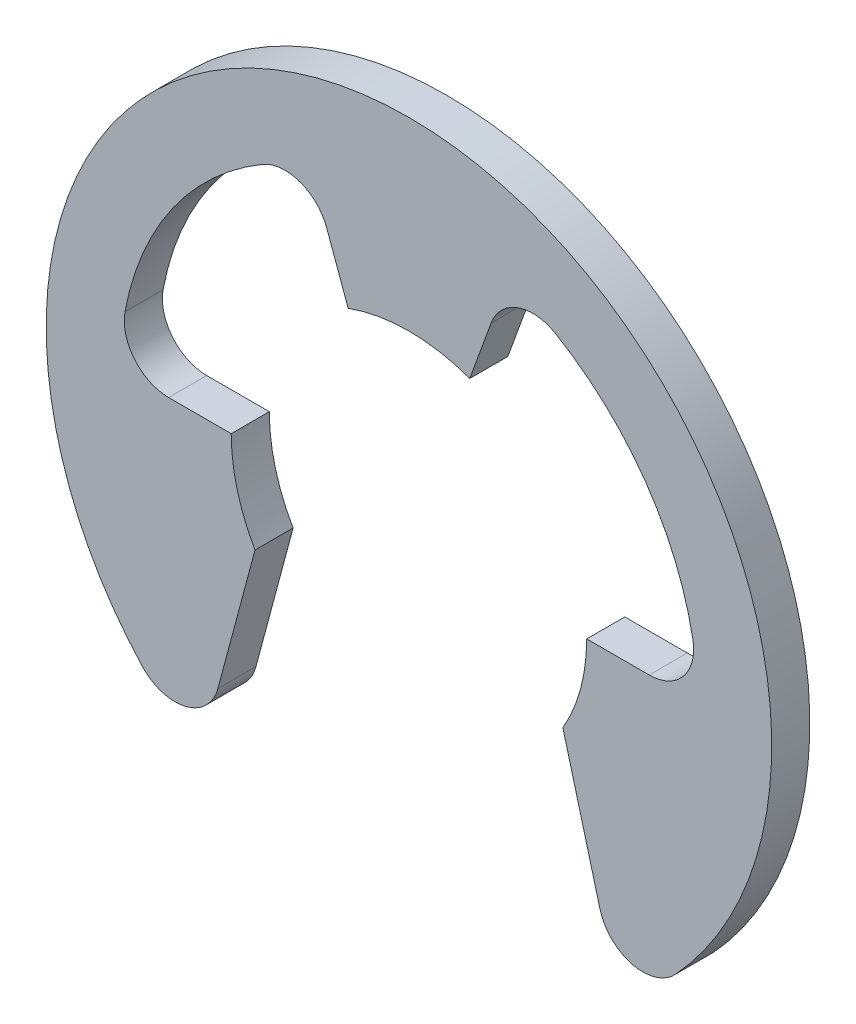
ISO-10303-21;
HEADER;
FILE_DESCRIPTION(('STEP AP214'),'2;1');
FILE_NAME('part.step','',(''),(''),'','','');
FILE_SCHEMA(('AUTOMOTIVE_DESIGN { 1 0 10303 214 1 1 1 1 }'));
ENDSEC;
DATA;
#1=APPLICATION_CONTEXT('core data for automotive mechanical design processes');
#2=APPLICATION_PROTOCOL_DEFINITION('international standard','automotive_design',2000,#1);
#3=PRODUCT_CONTEXT('',#1,'mechanical');
#4=PRODUCT('Part','Part','',(#3));
#5=PRODUCT_RELATED_PRODUCT_CATEGORY('part','',(#4));
#6=PRODUCT_DEFINITION_FORMATION('','',#4);
#7=PRODUCT_DEFINITION_CONTEXT('part definition',#1,'design');
#8=PRODUCT_DEFINITION('design','',#6,#7);
#9=PRODUCT_DEFINITION_SHAPE('','',#8);
#10=(LENGTH_UNIT() NAMED_UNIT(*) SI_UNIT(.MILLI.,.METRE.));
#11=(NAMED_UNIT(*) PLANE_ANGLE_UNIT() SI_UNIT($,.RADIAN.));
#12=(NAMED_UNIT(*) SI_UNIT($,.STERADIAN.) SOLID_ANGLE_UNIT());
#13=UNCERTAINTY_MEASURE_WITH_UNIT(LENGTH_MEASURE(1.E-05),#10,'distance_accuracy_value','');
#14=(GEOMETRIC_REPRESENTATION_CONTEXT(3) GLOBAL_UNCERTAINTY_ASSIGNED_CONTEXT((#13)) GLOBAL_UNIT_ASSIGNED_CONTEXT((#10,
#11,#12)) REPRESENTATION_CONTEXT('',''));
#15=CARTESIAN_POINT('',(0.,0.,0.));
#16=DIRECTION('',(0.,0.,1.));
#17=DIRECTION('',(1.,0.,0.));
#18=AXIS2_PLACEMENT_3D('',#15,#16,#17);
#19=CARTESIAN_POINT('',(0.,0.,-1.0668));
#20=DIRECTION('',(0.,0.,1.));
#21=DIRECTION('',(1.,0.,0.));
#22=AXIS2_PLACEMENT_3D('',#19,#20,#21);
#23=CYLINDRICAL_SURFACE('',#22,4.9784);
#24=CARTESIAN_POINT('',(0.,0.,0.));
#25=DIRECTION('',(0.,0.,-1.));
#26=DIRECTION('',(1.,0.,0.));
#27=AXIS2_PLACEMENT_3D('',#24,#25,#26);
#28=CIRCLE('',#27,4.9784);
#29=CARTESIAN_POINT('',(4.9784,0.,0.));
#30=VERTEX_POINT('',#29);
#31=CARTESIAN_POINT('',(4.31142087020045,-2.4892,0.));
#32=VERTEX_POINT('',#31);
#33=EDGE_CURVE('E191',#30,#32,#28,.T.);
#34=ORIENTED_EDGE('',*,*,#33,.F.);
#35=DIRECTION('',(0.,0.,1.));
#36=VECTOR('',#35,1.);
#37=CARTESIAN_POINT('',(4.9784,0.,-1.0668));
#38=LINE('',#37,#36);
#39=CARTESIAN_POINT('',(4.9784,0.,-1.0668));
#40=VERTEX_POINT('',#39);
#41=EDGE_CURVE('E11',#40,#30,#38,.T.);
#42=ORIENTED_EDGE('',*,*,#41,.F.);
#43=CARTESIAN_POINT('',(0.,0.,-1.0668));
#44=DIRECTION('',(0.,0.,-1.));
#45=DIRECTION('',(1.,0.,0.));
#46=AXIS2_PLACEMENT_3D('',#43,#44,#45);
#47=CIRCLE('',#46,4.9784);
#48=CARTESIAN_POINT('',(4.31142087020045,-2.4892,-1.0668));
#49=VERTEX_POINT('',#48);
#50=EDGE_CURVE('E243',#40,#49,#47,.T.);
#51=ORIENTED_EDGE('',*,*,#50,.T.);
#52=DIRECTION('',(0.,0.,1.));
#53=VECTOR('',#52,1.);
#54=CARTESIAN_POINT('',(4.31142087020045,-2.4892,-1.0668));
#55=LINE('',#54,#53);
#56=EDGE_CURVE('E37',#49,#32,#55,.T.);
#57=ORIENTED_EDGE('',*,*,#56,.T.);
#58=EDGE_LOOP('',(#34,#42,#51,#57));
#59=FACE_BOUND('',#58,.T.);
#60=ADVANCED_FACE('F34',(#59),#23,.F.);
#61=CARTESIAN_POINT('',(4.9784,0.,-1.0668));
#62=DIRECTION('',(0.,1.,0.));
#63=DIRECTION('',(-1.,0.,0.));
#64=AXIS2_PLACEMENT_3D('',#61,#62,#63);
#65=PLANE('',#64);
#66=DIRECTION('',(-1.,0.,0.));
#67=VECTOR('',#66,1.);
#68=CARTESIAN_POINT('',(4.9784,0.,0.));
#69=LINE('',#68,#67);
#70=CARTESIAN_POINT('',(6.7298416603305,0.,0.));
#71=VERTEX_POINT('',#70);
#72=EDGE_CURVE('E241',#71,#30,#69,.T.);
#73=ORIENTED_EDGE('',*,*,#72,.F.);
#74=DIRECTION('',(0.,0.,1.));
#75=VECTOR('',#74,1.);
#76=CARTESIAN_POINT('',(6.7298416603305,0.,-1.0668));
#77=LINE('',#76,#75);
#78=CARTESIAN_POINT('',(6.7298416603305,0.,-1.0668));
#79=VERTEX_POINT('',#78);
#80=EDGE_CURVE('E43',#79,#71,#77,.T.);
#81=ORIENTED_EDGE('',*,*,#80,.F.);
#82=DIRECTION('',(-1.,0.,0.));
#83=VECTOR('',#82,1.);
#84=CARTESIAN_POINT('',(4.9784,0.,-1.0668));
#85=LINE('',#84,#83);
#86=EDGE_CURVE('E181',#79,#40,#85,.T.);
#87=ORIENTED_EDGE('',*,*,#86,.T.);
#88=ORIENTED_EDGE('',*,*,#41,.T.);
#89=EDGE_LOOP('',(#73,#81,#87,#88));
#90=FACE_BOUND('',#89,.T.);
#91=ADVANCED_FACE('F275',(#90),#65,.T.);
#92=CARTESIAN_POINT('',(6.7298416603305,1.243584,-1.0668));
#93=DIRECTION('',(0.,0.,1.));
#94=DIRECTION('',(1.,0.,0.));
#95=AXIS2_PLACEMENT_3D('',#92,#93,#94);
#96=CYLINDRICAL_SURFACE('',#95,1.243584);
#97=CARTESIAN_POINT('',(6.7298416603305,1.243584,0.));
#98=DIRECTION('',(0.,0.,-1.));
#99=DIRECTION('',(1.,0.,0.));
#100=AXIS2_PLACEMENT_3D('',#97,#98,#99);
#101=CIRCLE('',#100,1.243584);
#102=CARTESIAN_POINT('',(7.95272262711264,1.46955591448931,0.));
#103=VERTEX_POINT('',#102);
#104=EDGE_CURVE('E168',#103,#71,#101,.T.);
#105=ORIENTED_EDGE('',*,*,#104,.F.);
#106=DIRECTION('',(0.,0.,1.));
#107=VECTOR('',#106,1.);
#108=CARTESIAN_POINT('',(7.95272262711264,1.46955591448931,-1.0668));
#109=LINE('',#108,#107);
#110=CARTESIAN_POINT('',(7.95272262711264,1.46955591448931,-1.0668));
#111=VERTEX_POINT('',#110);
#112=EDGE_CURVE('E163',#111,#103,#109,.T.);
#113=ORIENTED_EDGE('',*,*,#112,.F.);
#114=CARTESIAN_POINT('',(6.7298416603305,1.243584,-1.0668));
#115=DIRECTION('',(0.,0.,-1.));
#116=DIRECTION('',(1.,0.,0.));
#117=AXIS2_PLACEMENT_3D('',#114,#115,#116);
#118=CIRCLE('',#117,1.243584);
#119=EDGE_CURVE('E166',#111,#79,#118,.T.);
#120=ORIENTED_EDGE('',*,*,#119,.T.);
#121=ORIENTED_EDGE('',*,*,#80,.T.);
#122=EDGE_LOOP('',(#105,#113,#120,#121));
#123=FACE_BOUND('',#122,.T.);
#124=ADVANCED_FACE('F165',(#123),#96,.F.);
#125=CARTESIAN_POINT('',(0.,0.,-1.0668));
#126=DIRECTION('',(0.,0.,1.));
#127=DIRECTION('',(1.,0.,0.));
#128=AXIS2_PLACEMENT_3D('',#125,#126,#127);
#129=CYLINDRICAL_SURFACE('',#128,8.08736);
#130=CARTESIAN_POINT('',(0.,0.,0.));
#131=DIRECTION('',(0.,0.,-1.));
#132=DIRECTION('',(1.,0.,0.));
#133=AXIS2_PLACEMENT_3D('',#130,#131,#132);
#134=CIRCLE('',#133,8.08736);
#135=CARTESIAN_POINT('',(4.10092218143226,6.97049704335615,0.));
#136=VERTEX_POINT('',#135);
#137=EDGE_CURVE('E238',#136,#103,#134,.T.);
#138=ORIENTED_EDGE('',*,*,#137,.F.);
#139=DIRECTION('',(0.,0.,1.));
#140=VECTOR('',#139,1.);
#141=CARTESIAN_POINT('',(4.10092218143226,6.97049704335615,-1.0668));
#142=LINE('',#141,#140);
#143=CARTESIAN_POINT('',(4.10092218143226,6.97049704335615,-1.0668));
#144=VERTEX_POINT('',#143);
#145=EDGE_CURVE('E173',#144,#136,#142,.T.);
#146=ORIENTED_EDGE('',*,*,#145,.F.);
#147=CARTESIAN_POINT('',(0.,0.,-1.0668));
#148=DIRECTION('',(0.,0.,-1.));
#149=DIRECTION('',(1.,0.,0.));
#150=AXIS2_PLACEMENT_3D('',#147,#148,#149);
#151=CIRCLE('',#150,8.08736);
#152=EDGE_CURVE('E179',#144,#111,#151,.T.);
#153=ORIENTED_EDGE('',*,*,#152,.T.);
#154=ORIENTED_EDGE('',*,*,#112,.T.);
#155=EDGE_LOOP('',(#138,#146,#153,#154));
#156=FACE_BOUND('',#155,.T.);
#157=ADVANCED_FACE('F183',(#156),#129,.F.);
#158=CARTESIAN_POINT('',(3.47032811735272,5.89865176935265,-1.0668));
#159=DIRECTION('',(0.,0.,1.));
#160=DIRECTION('',(1.,0.,0.));
#161=AXIS2_PLACEMENT_3D('',#158,#159,#160);
#162=CYLINDRICAL_SURFACE('',#161,1.243584);
#163=CARTESIAN_POINT('',(3.47032811735272,5.89865176935265,0.));
#164=DIRECTION('',(0.,0.,-1.));
#165=DIRECTION('',(-1.,0.,0.));
#166=AXIS2_PLACEMENT_3D('',#163,#164,#165);
#167=CIRCLE('',#166,1.243584);
#168=CARTESIAN_POINT('',(2.3017414092253,6.32398254727016,0.));
#169=VERTEX_POINT('',#168);
#170=EDGE_CURVE('E235',#169,#136,#167,.T.);
#171=ORIENTED_EDGE('',*,*,#170,.F.);
#172=DIRECTION('',(0.,0.,1.));
#173=VECTOR('',#172,1.);
#174=CARTESIAN_POINT('',(2.3017414092253,6.32398254727016,-1.0668));
#175=LINE('',#174,#173);
#176=CARTESIAN_POINT('',(2.3017414092253,6.32398254727016,-1.0668));
#177=VERTEX_POINT('',#176);
#178=EDGE_CURVE('E247',#177,#169,#175,.T.);
#179=ORIENTED_EDGE('',*,*,#178,.F.);
#180=CARTESIAN_POINT('',(3.47032811735272,5.89865176935265,-1.0668));
#181=DIRECTION('',(0.,0.,-1.));
#182=DIRECTION('',(-1.,0.,0.));
#183=AXIS2_PLACEMENT_3D('',#180,#181,#182);
#184=CIRCLE('',#183,1.243584);
#185=EDGE_CURVE('E184',#177,#144,#184,.T.);
#186=ORIENTED_EDGE('',*,*,#185,.T.);
#187=ORIENTED_EDGE('',*,*,#145,.T.);
#188=EDGE_LOOP('',(#171,#179,#186,#187));
#189=FACE_BOUND('',#188,.T.);
#190=ADVANCED_FACE('F288',(#189),#162,.F.);
#191=CARTESIAN_POINT('',(1.70271308153251,4.67816574332056,-1.0668));
#192=DIRECTION('',(0.939692620785908,-0.342020143325669,0.));
#193=DIRECTION('',(0.342020143325669,0.939692620785908,0.));
#194=AXIS2_PLACEMENT_3D('',#191,#192,#193);
#195=PLANE('',#194);
#196=DIRECTION('',(0.342020143325669,0.939692620785908,0.));
#197=VECTOR('',#196,1.);
#198=CARTESIAN_POINT('',(1.70271308153251,4.67816574332056,0.));
#199=LINE('',#198,#197);
#200=CARTESIAN_POINT('',(1.70271308153251,4.67816574332056,0.));
#201=VERTEX_POINT('',#200);
#202=EDGE_CURVE('E232',#201,#169,#199,.T.);
#203=ORIENTED_EDGE('',*,*,#202,.F.);
#204=DIRECTION('',(0.,0.,1.));
#205=VECTOR('',#204,1.);
#206=CARTESIAN_POINT('',(1.70271308153251,4.67816574332056,-1.0668));
#207=LINE('',#206,#205);
#208=CARTESIAN_POINT('',(1.70271308153251,4.67816574332056,-1.0668));
#209=VERTEX_POINT('',#208);
#210=EDGE_CURVE('E249',#209,#201,#207,.T.);
#211=ORIENTED_EDGE('',*,*,#210,.F.);
#212=DIRECTION('',(0.342020143325669,0.939692620785908,0.));
#213=VECTOR('',#212,1.);
#214=CARTESIAN_POINT('',(1.70271308153251,4.67816574332056,-1.0668));
#215=LINE('',#214,#213);
#216=EDGE_CURVE('E186',#209,#177,#215,.T.);
#217=ORIENTED_EDGE('',*,*,#216,.T.);
#218=ORIENTED_EDGE('',*,*,#178,.T.);
#219=EDGE_LOOP('',(#203,#211,#217,#218));
#220=FACE_BOUND('',#219,.T.);
#221=ADVANCED_FACE('F291',(#220),#195,.T.);
#222=CARTESIAN_POINT('',(0.,0.,-1.0668));
#223=DIRECTION('',(0.,0.,1.));
#224=DIRECTION('',(1.,0.,0.));
#225=AXIS2_PLACEMENT_3D('',#222,#223,#224);
#226=CYLINDRICAL_SURFACE('',#225,4.9784);
#227=CARTESIAN_POINT('',(0.,0.,0.));
#228=DIRECTION('',(0.,0.,-1.));
#229=DIRECTION('',(1.,0.,0.));
#230=AXIS2_PLACEMENT_3D('',#227,#228,#229);
#231=CIRCLE('',#230,4.9784);
#232=CARTESIAN_POINT('',(-1.70271308153251,4.67816574332056,0.));
#233=VERTEX_POINT('',#232);
#234=EDGE_CURVE('E229',#233,#201,#231,.T.);
#235=ORIENTED_EDGE('',*,*,#234,.F.);
#236=DIRECTION('',(0.,0.,1.));
#237=VECTOR('',#236,1.);
#238=CARTESIAN_POINT('',(-1.70271308153251,4.67816574332056,-1.0668));
#239=LINE('',#238,#237);
#240=CARTESIAN_POINT('',(-1.70271308153251,4.67816574332056,-1.0668));
#241=VERTEX_POINT('',#240);
#242=EDGE_CURVE('E251',#241,#233,#239,.T.);
#243=ORIENTED_EDGE('',*,*,#242,.F.);
#244=CARTESIAN_POINT('',(0.,0.,-1.0668));
#245=DIRECTION('',(0.,0.,-1.));
#246=DIRECTION('',(1.,0.,0.));
#247=AXIS2_PLACEMENT_3D('',#244,#245,#246);
#248=CIRCLE('',#247,4.9784);
#249=EDGE_CURVE('E507',#241,#209,#248,.T.);
#250=ORIENTED_EDGE('',*,*,#249,.T.);
#251=ORIENTED_EDGE('',*,*,#210,.T.);
#252=EDGE_LOOP('',(#235,#243,#250,#251));
#253=FACE_BOUND('',#252,.T.);
#254=ADVANCED_FACE('F295',(#253),#226,.F.);
#255=CARTESIAN_POINT('',(-1.70271308153252,4.67816574332056,-1.0668));
#256=DIRECTION('',(-0.939692620785908,-0.34202014332567,0.));
#257=DIRECTION('',(0.34202014332567,-0.939692620785908,0.));
#258=AXIS2_PLACEMENT_3D('',#255,#256,#257);
#259=PLANE('',#258);
#260=DIRECTION('',(0.34202014332567,-0.939692620785908,0.));
#261=VECTOR('',#260,1.);
#262=CARTESIAN_POINT('',(-1.70271308153252,4.67816574332056,0.));
#263=LINE('',#262,#261);
#264=CARTESIAN_POINT('',(-2.3017414092253,6.32398254727015,0.));
#265=VERTEX_POINT('',#264);
#266=EDGE_CURVE('E226',#265,#233,#263,.T.);
#267=ORIENTED_EDGE('',*,*,#266,.F.);
#268=DIRECTION('',(0.,0.,1.));
#269=VECTOR('',#268,1.);
#270=CARTESIAN_POINT('',(-2.3017414092253,6.32398254727015,-1.0668));
#271=LINE('',#270,#269);
#272=CARTESIAN_POINT('',(-2.3017414092253,6.32398254727015,-1.0668));
#273=VERTEX_POINT('',#272);
#274=EDGE_CURVE('E253',#273,#265,#271,.T.);
#275=ORIENTED_EDGE('',*,*,#274,.F.);
#276=DIRECTION('',(0.34202014332567,-0.939692620785908,0.));
#277=VECTOR('',#276,1.);
#278=CARTESIAN_POINT('',(-1.70271308153252,4.67816574332056,-1.0668));
#279=LINE('',#278,#277);
#280=EDGE_CURVE('E511',#273,#241,#279,.T.);
#281=ORIENTED_EDGE('',*,*,#280,.T.);
#282=ORIENTED_EDGE('',*,*,#242,.T.);
#283=EDGE_LOOP('',(#267,#275,#281,#282));
#284=FACE_BOUND('',#283,.T.);
#285=ADVANCED_FACE('F299',(#284),#259,.T.);
#286=CARTESIAN_POINT('',(-3.47032811735273,5.89865176935264,-1.0668));
#287=DIRECTION('',(0.,0.,1.));
#288=DIRECTION('',(1.,0.,0.));
#289=AXIS2_PLACEMENT_3D('',#286,#287,#288);
#290=CYLINDRICAL_SURFACE('',#289,1.243584);
#291=CARTESIAN_POINT('',(-3.47032811735273,5.89865176935264,0.));
#292=DIRECTION('',(0.,0.,-1.));
#293=DIRECTION('',(1.,0.,0.));
#294=AXIS2_PLACEMENT_3D('',#291,#292,#293);
#295=CIRCLE('',#294,1.243584);
#296=CARTESIAN_POINT('',(-4.10092218143226,6.97049704335615,0.));
#297=VERTEX_POINT('',#296);
#298=EDGE_CURVE('E223',#297,#265,#295,.T.);
#299=ORIENTED_EDGE('',*,*,#298,.F.);
#300=DIRECTION('',(0.,0.,1.));
#301=VECTOR('',#300,1.);
#302=CARTESIAN_POINT('',(-4.10092218143226,6.97049704335615,-1.0668));
#303=LINE('',#302,#301);
#304=CARTESIAN_POINT('',(-4.10092218143226,6.97049704335615,-1.0668));
#305=VERTEX_POINT('',#304);
#306=EDGE_CURVE('E255',#305,#297,#303,.T.);
#307=ORIENTED_EDGE('',*,*,#306,.F.);
#308=CARTESIAN_POINT('',(-3.47032811735273,5.89865176935264,-1.0668));
#309=DIRECTION('',(0.,0.,-1.));
#310=DIRECTION('',(1.,0.,0.));
#311=AXIS2_PLACEMENT_3D('',#308,#309,#310);
#312=CIRCLE('',#311,1.243584);
#313=EDGE_CURVE('E500',#305,#273,#312,.T.);
#314=ORIENTED_EDGE('',*,*,#313,.T.);
#315=ORIENTED_EDGE('',*,*,#274,.T.);
#316=EDGE_LOOP('',(#299,#307,#314,#315));
#317=FACE_BOUND('',#316,.T.);
#318=ADVANCED_FACE('F303',(#317),#290,.F.);
#319=CARTESIAN_POINT('',(0.,0.,-1.0668));
#320=DIRECTION('',(0.,0.,1.));
#321=DIRECTION('',(1.,0.,0.));
#322=AXIS2_PLACEMENT_3D('',#319,#320,#321);
#323=CYLINDRICAL_SURFACE('',#322,8.08736);
#324=CARTESIAN_POINT('',(0.,0.,0.));
#325=DIRECTION('',(0.,0.,-1.));
#326=DIRECTION('',(1.,0.,0.));
#327=AXIS2_PLACEMENT_3D('',#324,#325,#326);
#328=CIRCLE('',#327,8.08736);
#329=CARTESIAN_POINT('',(-7.95272262711264,1.46955591448931,0.));
#330=VERTEX_POINT('',#329);
#331=EDGE_CURVE('E220',#330,#297,#328,.T.);
#332=ORIENTED_EDGE('',*,*,#331,.F.);
#333=DIRECTION('',(0.,0.,1.));
#334=VECTOR('',#333,1.);
#335=CARTESIAN_POINT('',(-7.95272262711264,1.46955591448931,-1.0668));
#336=LINE('',#335,#334);
#337=CARTESIAN_POINT('',(-7.95272262711264,1.46955591448931,-1.0668));
#338=VERTEX_POINT('',#337);
#339=EDGE_CURVE('E257',#338,#330,#336,.T.);
#340=ORIENTED_EDGE('',*,*,#339,.F.);
#341=CARTESIAN_POINT('',(0.,0.,-1.0668));
#342=DIRECTION('',(0.,0.,-1.));
#343=DIRECTION('',(1.,0.,0.));
#344=AXIS2_PLACEMENT_3D('',#341,#342,#343);
#345=CIRCLE('',#344,8.08736);
#346=EDGE_CURVE('E496',#338,#305,#345,.T.);
#347=ORIENTED_EDGE('',*,*,#346,.T.);
#348=ORIENTED_EDGE('',*,*,#306,.T.);
#349=EDGE_LOOP('',(#332,#340,#347,#348));
#350=FACE_BOUND('',#349,.T.);
#351=ADVANCED_FACE('F307',(#350),#323,.F.);
#352=CARTESIAN_POINT('',(-6.7298416603305,1.243584,-1.0668));
#353=DIRECTION('',(0.,0.,1.));
#354=DIRECTION('',(1.,0.,0.));
#355=AXIS2_PLACEMENT_3D('',#352,#353,#354);
#356=CYLINDRICAL_SURFACE('',#355,1.243584);
#357=CARTESIAN_POINT('',(-6.7298416603305,1.243584,0.));
#358=DIRECTION('',(0.,0.,-1.));
#359=DIRECTION('',(-1.,0.,0.));
#360=AXIS2_PLACEMENT_3D('',#357,#358,#359);
#361=CIRCLE('',#360,1.243584);
#362=CARTESIAN_POINT('',(-6.7298416603305,0.,0.));
#363=VERTEX_POINT('',#362);
#364=EDGE_CURVE('E217',#363,#330,#361,.T.);
#365=ORIENTED_EDGE('',*,*,#364,.F.);
#366=DIRECTION('',(0.,0.,1.));
#367=VECTOR('',#366,1.);
#368=CARTESIAN_POINT('',(-6.7298416603305,0.,-1.0668));
#369=LINE('',#368,#367);
#370=CARTESIAN_POINT('',(-6.7298416603305,0.,-1.0668));
#371=VERTEX_POINT('',#370);
#372=EDGE_CURVE('E259',#371,#363,#369,.T.);
#373=ORIENTED_EDGE('',*,*,#372,.F.);
#374=CARTESIAN_POINT('',(-6.7298416603305,1.243584,-1.0668));
#375=DIRECTION('',(0.,0.,-1.));
#376=DIRECTION('',(-1.,0.,0.));
#377=AXIS2_PLACEMENT_3D('',#374,#375,#376);
#378=CIRCLE('',#377,1.243584);
#379=EDGE_CURVE('E517',#371,#338,#378,.T.);
#380=ORIENTED_EDGE('',*,*,#379,.T.);
#381=ORIENTED_EDGE('',*,*,#339,.T.);
#382=EDGE_LOOP('',(#365,#373,#380,#381));
#383=FACE_BOUND('',#382,.T.);
#384=ADVANCED_FACE('F311',(#383),#356,.F.);
#385=CARTESIAN_POINT('',(-4.9784,0.,-1.0668));
#386=DIRECTION('',(0.,1.,0.));
#387=DIRECTION('',(-1.,0.,0.));
#388=AXIS2_PLACEMENT_3D('',#385,#386,#387);
#389=PLANE('',#388);
#390=DIRECTION('',(-1.,0.,0.));
#391=VECTOR('',#390,1.);
#392=CARTESIAN_POINT('',(-4.9784,0.,0.));
#393=LINE('',#392,#391);
#394=CARTESIAN_POINT('',(-4.9784,0.,0.));
#395=VERTEX_POINT('',#394);
#396=EDGE_CURVE('E214',#395,#363,#393,.T.);
#397=ORIENTED_EDGE('',*,*,#396,.F.);
#398=DIRECTION('',(0.,0.,1.));
#399=VECTOR('',#398,1.);
#400=CARTESIAN_POINT('',(-4.9784,0.,-1.0668));
#401=LINE('',#400,#399);
#402=CARTESIAN_POINT('',(-4.9784,0.,-1.0668));
#403=VERTEX_POINT('',#402);
#404=EDGE_CURVE('E261',#403,#395,#401,.T.);
#405=ORIENTED_EDGE('',*,*,#404,.F.);
#406=DIRECTION('',(-1.,0.,0.));
#407=VECTOR('',#406,1.);
#408=CARTESIAN_POINT('',(-4.9784,0.,-1.0668));
#409=LINE('',#408,#407);
#410=EDGE_CURVE('E489',#403,#371,#409,.T.);
#411=ORIENTED_EDGE('',*,*,#410,.T.);
#412=ORIENTED_EDGE('',*,*,#372,.T.);
#413=EDGE_LOOP('',(#397,#405,#411,#412));
#414=FACE_BOUND('',#413,.T.);
#415=ADVANCED_FACE('F315',(#414),#389,.T.);
#416=CARTESIAN_POINT('',(0.,0.,-1.0668));
#417=DIRECTION('',(0.,0.,1.));
#418=DIRECTION('',(1.,0.,0.));
#419=AXIS2_PLACEMENT_3D('',#416,#417,#418);
#420=CYLINDRICAL_SURFACE('',#419,4.9784);
#421=CARTESIAN_POINT('',(0.,0.,0.));
#422=DIRECTION('',(0.,0.,-1.));
#423=DIRECTION('',(1.,0.,0.));
#424=AXIS2_PLACEMENT_3D('',#421,#422,#423);
#425=CIRCLE('',#424,4.9784);
#426=CARTESIAN_POINT('',(-4.31142087020045,-2.4892,0.));
#427=VERTEX_POINT('',#426);
#428=EDGE_CURVE('E211',#427,#395,#425,.T.);
#429=ORIENTED_EDGE('',*,*,#428,.F.);
#430=DIRECTION('',(0.,0.,1.));
#431=VECTOR('',#430,1.);
#432=CARTESIAN_POINT('',(-4.31142087020045,-2.4892,-1.0668));
#433=LINE('',#432,#431);
#434=CARTESIAN_POINT('',(-4.31142087020045,-2.4892,-1.0668));
#435=VERTEX_POINT('',#434);
#436=EDGE_CURVE('E263',#435,#427,#433,.T.);
#437=ORIENTED_EDGE('',*,*,#436,.F.);
#438=CARTESIAN_POINT('',(0.,0.,-1.0668));
#439=DIRECTION('',(0.,0.,-1.));
#440=DIRECTION('',(1.,0.,0.));
#441=AXIS2_PLACEMENT_3D('',#438,#439,#440);
#442=CIRCLE('',#441,4.9784);
#443=EDGE_CURVE('E485',#435,#403,#442,.T.);
#444=ORIENTED_EDGE('',*,*,#443,.T.);
#445=ORIENTED_EDGE('',*,*,#404,.T.);
#446=EDGE_LOOP('',(#429,#437,#444,#445));
#447=FACE_BOUND('',#446,.T.);
#448=ADVANCED_FACE('F319',(#447),#420,.F.);
#449=CARTESIAN_POINT('',(-4.31142087020045,-2.48920000000001,-1.0668));
#450=DIRECTION('',(0.965925826289068,-0.258819045102522,0.));
#451=DIRECTION('',(0.258819045102522,0.965925826289068,0.));
#452=AXIS2_PLACEMENT_3D('',#449,#450,#451);
#453=PLANE('',#452);
#454=DIRECTION('',(0.258819045102522,0.965925826289068,0.));
#455=VECTOR('',#454,1.);
#456=CARTESIAN_POINT('',(-4.31142087020045,-2.48920000000001,0.));
#457=LINE('',#456,#455);
#458=CARTESIAN_POINT('',(-5.3510620601723,-6.36919374261631,0.));
#459=VERTEX_POINT('',#458);
#460=EDGE_CURVE('E208',#459,#427,#457,.T.);
#461=ORIENTED_EDGE('',*,*,#460,.F.);
#462=DIRECTION('',(0.,0.,1.));
#463=VECTOR('',#462,1.);
#464=CARTESIAN_POINT('',(-5.3510620601723,-6.36919374261631,-1.0668));
#465=LINE('',#464,#463);
#466=CARTESIAN_POINT('',(-5.3510620601723,-6.36919374261631,-1.0668));
#467=VERTEX_POINT('',#466);
#468=EDGE_CURVE('E265',#467,#459,#465,.T.);
#469=ORIENTED_EDGE('',*,*,#468,.F.);
#470=DIRECTION('',(0.258819045102522,0.965925826289068,0.));
#471=VECTOR('',#470,1.);
#472=CARTESIAN_POINT('',(-4.31142087020045,-2.48920000000001,-1.0668));
#473=LINE('',#472,#471);
#474=EDGE_CURVE('E521',#467,#435,#473,.T.);
#475=ORIENTED_EDGE('',*,*,#474,.T.);
#476=ORIENTED_EDGE('',*,*,#436,.T.);
#477=EDGE_LOOP('',(#461,#469,#475,#476));
#478=FACE_BOUND('',#477,.T.);
#479=ADVANCED_FACE('F323',(#478),#453,.T.);
#480=CARTESIAN_POINT('',(-6.55227196293216,-6.04733051923153,-1.0668));
#481=DIRECTION('',(0.,0.,1.));
#482=DIRECTION('',(1.,0.,0.));
#483=AXIS2_PLACEMENT_3D('',#480,#481,#482);
#484=CYLINDRICAL_SURFACE('',#483,1.243584);
#485=CARTESIAN_POINT('',(-6.55227196293216,-6.04733051923153,0.));
#486=DIRECTION('',(0.,0.,1.));
#487=DIRECTION('',(-1.,0.,0.));
#488=AXIS2_PLACEMENT_3D('',#485,#486,#487);
#489=CIRCLE('',#488,1.243584);
#490=CARTESIAN_POINT('',(-7.46612575539216,-6.89075947952545,0.));
#491=VERTEX_POINT('',#490);
#492=EDGE_CURVE('E205',#491,#459,#489,.T.);
#493=ORIENTED_EDGE('',*,*,#492,.F.);
#494=DIRECTION('',(0.,0.,1.));
#495=VECTOR('',#494,1.);
#496=CARTESIAN_POINT('',(-7.46612575539216,-6.89075947952545,-1.0668));
#497=LINE('',#496,#495);
#498=CARTESIAN_POINT('',(-7.46612575539216,-6.89075947952545,-1.0668));
#499=VERTEX_POINT('',#498);
#500=EDGE_CURVE('E267',#499,#491,#497,.T.);
#501=ORIENTED_EDGE('',*,*,#500,.F.);
#502=CARTESIAN_POINT('',(-6.55227196293216,-6.04733051923153,-1.0668));
#503=DIRECTION('',(0.,0.,1.));
#504=DIRECTION('',(-1.,0.,0.));
#505=AXIS2_PLACEMENT_3D('',#502,#503,#504);
#506=CIRCLE('',#505,1.243584);
#507=EDGE_CURVE('E478',#499,#467,#506,.T.);
#508=ORIENTED_EDGE('',*,*,#507,.T.);
#509=ORIENTED_EDGE('',*,*,#468,.T.);
#510=EDGE_LOOP('',(#493,#501,#508,#509));
#511=FACE_BOUND('',#510,.T.);
#512=ADVANCED_FACE('F327',(#511),#484,.T.);
#513=CARTESIAN_POINT('',(0.,0.,-1.0668));
#514=DIRECTION('',(0.,0.,1.));
#515=DIRECTION('',(1.,0.,0.));
#516=AXIS2_PLACEMENT_3D('',#513,#514,#515);
#517=CYLINDRICAL_SURFACE('',#516,10.16);
#518=CARTESIAN_POINT('',(0.,0.,0.));
#519=DIRECTION('',(0.,0.,1.));
#520=DIRECTION('',(1.,0.,0.));
#521=AXIS2_PLACEMENT_3D('',#518,#519,#520);
#522=CIRCLE('',#521,10.16);
#523=CARTESIAN_POINT('',(7.46612575539216,-6.89075947952545,0.));
#524=VERTEX_POINT('',#523);
#525=EDGE_CURVE('E201',#524,#491,#522,.T.);
#526=ORIENTED_EDGE('',*,*,#525,.F.);
#527=DIRECTION('',(0.,0.,1.));
#528=VECTOR('',#527,1.);
#529=CARTESIAN_POINT('',(7.46612575539216,-6.89075947952545,-1.0668));
#530=LINE('',#529,#528);
#531=CARTESIAN_POINT('',(7.46612575539216,-6.89075947952545,-1.0668));
#532=VERTEX_POINT('',#531);
#533=EDGE_CURVE('E269',#532,#524,#530,.T.);
#534=ORIENTED_EDGE('',*,*,#533,.F.);
#535=CARTESIAN_POINT('',(0.,0.,-1.0668));
#536=DIRECTION('',(0.,0.,1.));
#537=DIRECTION('',(1.,0.,0.));
#538=AXIS2_PLACEMENT_3D('',#535,#536,#537);
#539=CIRCLE('',#538,10.16);
#540=EDGE_CURVE('E474',#532,#499,#539,.T.);
#541=ORIENTED_EDGE('',*,*,#540,.T.);
#542=ORIENTED_EDGE('',*,*,#500,.T.);
#543=EDGE_LOOP('',(#526,#534,#541,#542));
#544=FACE_BOUND('',#543,.T.);
#545=ADVANCED_FACE('F331',(#544),#517,.T.);
#546=CARTESIAN_POINT('',(6.55227196293216,-6.04733051923153,-1.0668));
#547=DIRECTION('',(0.,0.,1.));
#548=DIRECTION('',(1.,0.,0.));
#549=AXIS2_PLACEMENT_3D('',#546,#547,#548);
#550=CYLINDRICAL_SURFACE('',#549,1.243584);
#551=CARTESIAN_POINT('',(6.55227196293216,-6.04733051923153,0.));
#552=DIRECTION('',(0.,0.,1.));
#553=DIRECTION('',(1.,0.,0.));
#554=AXIS2_PLACEMENT_3D('',#551,#552,#553);
#555=CIRCLE('',#554,1.243584);
#556=CARTESIAN_POINT('',(5.3510620601723,-6.3691937426163,0.));
#557=VERTEX_POINT('',#556);
#558=EDGE_CURVE('E198',#557,#524,#555,.T.);
#559=ORIENTED_EDGE('',*,*,#558,.F.);
#560=DIRECTION('',(0.,0.,1.));
#561=VECTOR('',#560,1.);
#562=CARTESIAN_POINT('',(5.3510620601723,-6.3691937426163,-1.0668));
#563=LINE('',#562,#561);
#564=CARTESIAN_POINT('',(5.3510620601723,-6.3691937426163,-1.0668));
#565=VERTEX_POINT('',#564);
#566=EDGE_CURVE('E270',#565,#557,#563,.T.);
#567=ORIENTED_EDGE('',*,*,#566,.F.);
#568=CARTESIAN_POINT('',(6.55227196293216,-6.04733051923153,-1.0668));
#569=DIRECTION('',(0.,0.,1.));
#570=DIRECTION('',(1.,0.,0.));
#571=AXIS2_PLACEMENT_3D('',#568,#569,#570);
#572=CIRCLE('',#571,1.243584);
#573=EDGE_CURVE('E525',#565,#532,#572,.T.);
#574=ORIENTED_EDGE('',*,*,#573,.T.);
#575=ORIENTED_EDGE('',*,*,#533,.T.);
#576=EDGE_LOOP('',(#559,#567,#574,#575));
#577=FACE_BOUND('',#576,.T.);
#578=ADVANCED_FACE('F335',(#577),#550,.T.);
#579=CARTESIAN_POINT('',(4.31142087020045,-2.4892,-1.0668));
#580=DIRECTION('',(-0.965925826289068,-0.258819045102522,0.));
#581=DIRECTION('',(0.258819045102522,-0.965925826289068,0.));
#582=AXIS2_PLACEMENT_3D('',#579,#580,#581);
#583=PLANE('',#582);
#584=DIRECTION('',(0.258819045102523,-0.965925826289068,0.));
#585=VECTOR('',#584,1.);
#586=CARTESIAN_POINT('',(4.31142087020045,-2.4892,0.));
#587=LINE('',#586,#585);
#588=EDGE_CURVE('E194',#32,#557,#587,.T.);
#589=ORIENTED_EDGE('',*,*,#588,.F.);
#590=ORIENTED_EDGE('',*,*,#56,.F.);
#591=DIRECTION('',(0.258819045102523,-0.965925826289068,0.));
#592=VECTOR('',#591,1.);
#593=CARTESIAN_POINT('',(4.31142087020045,-2.4892,-1.0668));
#594=LINE('',#593,#592);
#595=EDGE_CURVE('E527',#49,#565,#594,.T.);
#596=ORIENTED_EDGE('',*,*,#595,.T.);
#597=ORIENTED_EDGE('',*,*,#566,.T.);
#598=EDGE_LOOP('',(#589,#590,#596,#597));
#599=FACE_BOUND('',#598,.T.);
#600=ADVANCED_FACE('F272',(#599),#583,.T.);
#601=CARTESIAN_POINT('',(0.,0.,-1.0668));
#602=DIRECTION('',(0.,0.,1.));
#603=DIRECTION('',(1.,0.,0.));
#604=AXIS2_PLACEMENT_3D('',#601,#602,#603);
#605=PLANE('',#604);
#606=ORIENTED_EDGE('',*,*,#50,.F.);
#607=ORIENTED_EDGE('',*,*,#86,.F.);
#608=ORIENTED_EDGE('',*,*,#119,.F.);
#609=ORIENTED_EDGE('',*,*,#152,.F.);
#610=ORIENTED_EDGE('',*,*,#185,.F.);
#611=ORIENTED_EDGE('',*,*,#216,.F.);
#612=ORIENTED_EDGE('',*,*,#249,.F.);
#613=ORIENTED_EDGE('',*,*,#280,.F.);
#614=ORIENTED_EDGE('',*,*,#313,.F.);
#615=ORIENTED_EDGE('',*,*,#346,.F.);
#616=ORIENTED_EDGE('',*,*,#379,.F.);
#617=ORIENTED_EDGE('',*,*,#410,.F.);
#618=ORIENTED_EDGE('',*,*,#443,.F.);
#619=ORIENTED_EDGE('',*,*,#474,.F.);
#620=ORIENTED_EDGE('',*,*,#507,.F.);
#621=ORIENTED_EDGE('',*,*,#540,.F.);
#622=ORIENTED_EDGE('',*,*,#573,.F.);
#623=ORIENTED_EDGE('',*,*,#595,.F.);
#624=EDGE_LOOP('',(#606,#607,#608,#609,#610,#611,#612,#613,#614,#615,#616,#617,#618,#619,#620,
#621,#622,#623));
#625=FACE_BOUND('',#624,.T.);
#626=ADVANCED_FACE('F177',(#625),#605,.F.);
#627=CARTESIAN_POINT('',(0.,0.,0.));
#628=DIRECTION('',(0.,0.,1.));
#629=DIRECTION('',(1.,0.,0.));
#630=AXIS2_PLACEMENT_3D('',#627,#628,#629);
#631=PLANE('',#630);
#632=ORIENTED_EDGE('',*,*,#33,.T.);
#633=ORIENTED_EDGE('',*,*,#588,.T.);
#634=ORIENTED_EDGE('',*,*,#558,.T.);
#635=ORIENTED_EDGE('',*,*,#525,.T.);
#636=ORIENTED_EDGE('',*,*,#492,.T.);
#637=ORIENTED_EDGE('',*,*,#460,.T.);
#638=ORIENTED_EDGE('',*,*,#428,.T.);
#639=ORIENTED_EDGE('',*,*,#396,.T.);
#640=ORIENTED_EDGE('',*,*,#364,.T.);
#641=ORIENTED_EDGE('',*,*,#331,.T.);
#642=ORIENTED_EDGE('',*,*,#298,.T.);
#643=ORIENTED_EDGE('',*,*,#266,.T.);
#644=ORIENTED_EDGE('',*,*,#234,.T.);
#645=ORIENTED_EDGE('',*,*,#202,.T.);
#646=ORIENTED_EDGE('',*,*,#170,.T.);
#647=ORIENTED_EDGE('',*,*,#137,.T.);
#648=ORIENTED_EDGE('',*,*,#104,.T.);
#649=ORIENTED_EDGE('',*,*,#72,.T.);
#650=EDGE_LOOP('',(#632,#633,#634,#635,#636,#637,#638,#639,#640,#641,#642,#643,#644,#645,#646,
#647,#648,#649));
#651=FACE_BOUND('',#650,.T.);
#652=ADVANCED_FACE('F274',(#651),#631,.T.);
#653=CLOSED_SHELL('',(#60,#91,#124,#157,#190,#221,#254,#285,#318,#351,#384,#415,#448,#479,#512,
#545,#578,#600,#626,#652));
#654=MANIFOLD_SOLID_BREP('B2',#653);
#655=ADVANCED_BREP_SHAPE_REPRESENTATION('',(#18,#654),#14);
#656=SHAPE_DEFINITION_REPRESENTATION(#9,#655);
ENDSEC;
END-ISO-10303-21;
